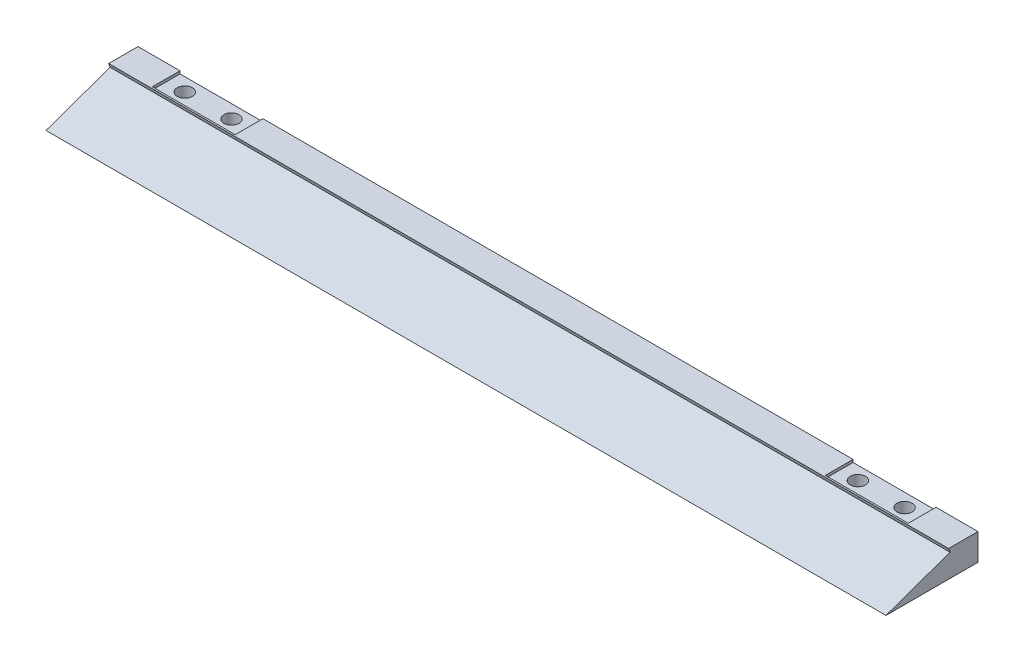
ISO-10303-21;
HEADER;
FILE_DESCRIPTION(('STEP AP214'),'2;1');
FILE_NAME('part.step','',(''),(''),'','','');
FILE_SCHEMA(('AUTOMOTIVE_DESIGN { 1 0 10303 214 1 1 1 1 }'));
ENDSEC;
DATA;
#1=APPLICATION_CONTEXT('core data for automotive mechanical design processes');
#2=APPLICATION_PROTOCOL_DEFINITION('international standard','automotive_design',2000,#1);
#3=PRODUCT_CONTEXT('',#1,'mechanical');
#4=PRODUCT('Part','Part','',(#3));
#5=PRODUCT_RELATED_PRODUCT_CATEGORY('part','',(#4));
#6=PRODUCT_DEFINITION_FORMATION('','',#4);
#7=PRODUCT_DEFINITION_CONTEXT('part definition',#1,'design');
#8=PRODUCT_DEFINITION('design','',#6,#7);
#9=PRODUCT_DEFINITION_SHAPE('','',#8);
#10=(LENGTH_UNIT() NAMED_UNIT(*) SI_UNIT(.MILLI.,.METRE.));
#11=(NAMED_UNIT(*) PLANE_ANGLE_UNIT() SI_UNIT($,.RADIAN.));
#12=(NAMED_UNIT(*) SI_UNIT($,.STERADIAN.) SOLID_ANGLE_UNIT());
#13=UNCERTAINTY_MEASURE_WITH_UNIT(LENGTH_MEASURE(1.E-05),#10,'distance_accuracy_value','');
#14=(GEOMETRIC_REPRESENTATION_CONTEXT(3) GLOBAL_UNCERTAINTY_ASSIGNED_CONTEXT((#13)) GLOBAL_UNIT_ASSIGNED_CONTEXT((#10,
#11,#12)) REPRESENTATION_CONTEXT('',''));
#15=CARTESIAN_POINT('',(0.,0.,0.));
#16=DIRECTION('',(0.,0.,1.));
#17=DIRECTION('',(1.,0.,0.));
#18=AXIS2_PLACEMENT_3D('',#15,#16,#17);
#19=CARTESIAN_POINT('',(0.,0.,0.));
#20=DIRECTION('',(0.,-1.,0.));
#21=DIRECTION('',(0.,0.,-1.));
#22=AXIS2_PLACEMENT_3D('',#19,#20,#21);
#23=PLANE('',#22);
#24=DIRECTION('',(-1.,0.,0.));
#25=VECTOR('',#24,1.);
#26=CARTESIAN_POINT('',(-83.164600061,0.,-14.35));
#27=LINE('',#26,#25);
#28=CARTESIAN_POINT('',(-83.164600061,0.,-14.35));
#29=VERTEX_POINT('',#28);
#30=CARTESIAN_POINT('',(-88.214600061,0.,-14.35));
#31=VERTEX_POINT('',#30);
#32=EDGE_CURVE('E308',#29,#31,#27,.T.);
#33=ORIENTED_EDGE('',*,*,#32,.T.);
#34=DIRECTION('',(0.,0.,1.));
#35=VECTOR('',#34,1.);
#36=CARTESIAN_POINT('',(-88.214600061,0.,-14.35));
#37=LINE('',#36,#35);
#38=CARTESIAN_POINT('',(-88.214600061,0.,-9.30000000000001));
#39=VERTEX_POINT('',#38);
#40=EDGE_CURVE('E69',#31,#39,#37,.T.);
#41=ORIENTED_EDGE('',*,*,#40,.T.);
#42=DIRECTION('',(1.,0.,0.));
#43=VECTOR('',#42,1.);
#44=CARTESIAN_POINT('',(-83.164600061,0.,-9.30000000000001));
#45=LINE('',#44,#43);
#46=CARTESIAN_POINT('',(-83.164600061,0.,-9.30000000000001));
#47=VERTEX_POINT('',#46);
#48=EDGE_CURVE('E296',#39,#47,#45,.T.);
#49=ORIENTED_EDGE('',*,*,#48,.T.);
#50=DIRECTION('',(0.,0.,-1.));
#51=VECTOR('',#50,1.);
#52=CARTESIAN_POINT('',(-83.164600061,0.,-14.35));
#53=LINE('',#52,#51);
#54=EDGE_CURVE('E312',#47,#29,#53,.T.);
#55=ORIENTED_EDGE('',*,*,#54,.T.);
#56=EDGE_LOOP('',(#33,#41,#49,#55));
#57=FACE_BOUND('',#56,.T.);
#58=DIRECTION('',(0.,0.,1.));
#59=VECTOR('',#58,1.);
#60=CARTESIAN_POINT('',(77.089400061,0.,-14.35));
#61=LINE('',#60,#59);
#62=CARTESIAN_POINT('',(77.089400061,0.,-14.35));
#63=VERTEX_POINT('',#62);
#64=CARTESIAN_POINT('',(77.089400061,0.,-9.30000000000001));
#65=VERTEX_POINT('',#64);
#66=EDGE_CURVE('E356',#63,#65,#61,.T.);
#67=ORIENTED_EDGE('',*,*,#66,.F.);
#68=DIRECTION('',(1.,0.,0.));
#69=VECTOR('',#68,1.);
#70=CARTESIAN_POINT('',(72.039400061,0.,-14.35));
#71=LINE('',#70,#69);
#72=CARTESIAN_POINT('',(72.039400061,0.,-14.35));
#73=VERTEX_POINT('',#72);
#74=EDGE_CURVE('E343',#73,#63,#71,.T.);
#75=ORIENTED_EDGE('',*,*,#74,.F.);
#76=DIRECTION('',(0.,0.,-1.));
#77=VECTOR('',#76,1.);
#78=CARTESIAN_POINT('',(72.039400061,0.,-14.35));
#79=LINE('',#78,#77);
#80=CARTESIAN_POINT('',(72.039400061,0.,-9.30000000000001));
#81=VERTEX_POINT('',#80);
#82=EDGE_CURVE('E364',#81,#73,#79,.T.);
#83=ORIENTED_EDGE('',*,*,#82,.F.);
#84=DIRECTION('',(-1.,0.,0.));
#85=VECTOR('',#84,1.);
#86=CARTESIAN_POINT('',(72.039400061,0.,-9.30000000000001));
#87=LINE('',#86,#85);
#88=EDGE_CURVE('E359',#65,#81,#87,.T.);
#89=ORIENTED_EDGE('',*,*,#88,.F.);
#90=EDGE_LOOP('',(#67,#75,#83,#89));
#91=FACE_BOUND('',#90,.T.);
#92=DIRECTION('',(0.,0.,1.));
#93=VECTOR('',#92,1.);
#94=CARTESIAN_POINT('',(88.214600061,0.,-14.35));
#95=LINE('',#94,#93);
#96=CARTESIAN_POINT('',(88.214600061,0.,-14.35));
#97=VERTEX_POINT('',#96);
#98=CARTESIAN_POINT('',(88.214600061,0.,-9.30000000000001));
#99=VERTEX_POINT('',#98);
#100=EDGE_CURVE('E360',#97,#99,#95,.T.);
#101=ORIENTED_EDGE('',*,*,#100,.F.);
#102=DIRECTION('',(1.,0.,0.));
#103=VECTOR('',#102,1.);
#104=CARTESIAN_POINT('',(83.164600061,0.,-14.35));
#105=LINE('',#104,#103);
#106=CARTESIAN_POINT('',(83.164600061,0.,-14.35));
#107=VERTEX_POINT('',#106);
#108=EDGE_CURVE('E397',#107,#97,#105,.T.);
#109=ORIENTED_EDGE('',*,*,#108,.F.);
#110=DIRECTION('',(0.,0.,-1.));
#111=VECTOR('',#110,1.);
#112=CARTESIAN_POINT('',(83.164600061,0.,-14.35));
#113=LINE('',#112,#111);
#114=CARTESIAN_POINT('',(83.164600061,0.,-9.30000000000001));
#115=VERTEX_POINT('',#114);
#116=EDGE_CURVE('E401',#115,#107,#113,.T.);
#117=ORIENTED_EDGE('',*,*,#116,.F.);
#118=DIRECTION('',(-1.,0.,0.));
#119=VECTOR('',#118,1.);
#120=CARTESIAN_POINT('',(83.164600061,0.,-9.30000000000001));
#121=LINE('',#120,#119);
#122=EDGE_CURVE('E406',#99,#115,#121,.T.);
#123=ORIENTED_EDGE('',*,*,#122,.F.);
#124=EDGE_LOOP('',(#101,#109,#117,#123));
#125=FACE_BOUND('',#124,.T.);
#126=DIRECTION('',(1.,0.,0.));
#127=VECTOR('',#126,1.);
#128=CARTESIAN_POINT('',(-100.001,0.,6.90747050814267));
#129=LINE('',#128,#127);
#130=CARTESIAN_POINT('',(-100.,0.,6.90747050814267));
#131=VERTEX_POINT('',#130);
#132=CARTESIAN_POINT('',(100.,0.,6.90747050814267));
#133=VERTEX_POINT('',#132);
#134=EDGE_CURVE('E526',#131,#133,#129,.T.);
#135=ORIENTED_EDGE('',*,*,#134,.F.);
#136=DIRECTION('',(0.,0.,1.));
#137=VECTOR('',#136,1.);
#138=CARTESIAN_POINT('',(-100.,0.,15.));
#139=LINE('',#138,#137);
#140=CARTESIAN_POINT('',(-100.,0.,-15.));
#141=VERTEX_POINT('',#140);
#142=EDGE_CURVE('E544',#141,#131,#139,.T.);
#143=ORIENTED_EDGE('',*,*,#142,.F.);
#144=DIRECTION('',(-1.,0.,0.));
#145=VECTOR('',#144,1.);
#146=CARTESIAN_POINT('',(-100.,0.,-15.));
#147=LINE('',#146,#145);
#148=CARTESIAN_POINT('',(100.,0.,-15.));
#149=VERTEX_POINT('',#148);
#150=EDGE_CURVE('E556',#149,#141,#147,.T.);
#151=ORIENTED_EDGE('',*,*,#150,.F.);
#152=DIRECTION('',(0.,0.,-1.));
#153=VECTOR('',#152,1.);
#154=CARTESIAN_POINT('',(100.,0.,15.));
#155=LINE('',#154,#153);
#156=EDGE_CURVE('E539',#133,#149,#155,.T.);
#157=ORIENTED_EDGE('',*,*,#156,.F.);
#158=EDGE_LOOP('',(#135,#143,#151,#157));
#159=FACE_BOUND('',#158,.T.);
#160=DIRECTION('',(-1.,0.,0.));
#161=VECTOR('',#160,1.);
#162=CARTESIAN_POINT('',(-72.039400061,0.,-14.35));
#163=LINE('',#162,#161);
#164=CARTESIAN_POINT('',(-72.039400061,0.,-14.35));
#165=VERTEX_POINT('',#164);
#166=CARTESIAN_POINT('',(-77.089400061,0.,-14.35));
#167=VERTEX_POINT('',#166);
#168=EDGE_CURVE('E275',#165,#167,#163,.T.);
#169=ORIENTED_EDGE('',*,*,#168,.T.);
#170=DIRECTION('',(0.,0.,1.));
#171=VECTOR('',#170,1.);
#172=CARTESIAN_POINT('',(-77.089400061,0.,-14.35));
#173=LINE('',#172,#171);
#174=CARTESIAN_POINT('',(-77.089400061,0.,-9.30000000000001));
#175=VERTEX_POINT('',#174);
#176=EDGE_CURVE('E61',#167,#175,#173,.T.);
#177=ORIENTED_EDGE('',*,*,#176,.T.);
#178=DIRECTION('',(1.,0.,0.));
#179=VECTOR('',#178,1.);
#180=CARTESIAN_POINT('',(-72.039400061,0.,-9.30000000000001));
#181=LINE('',#180,#179);
#182=CARTESIAN_POINT('',(-72.039400061,0.,-9.30000000000001));
#183=VERTEX_POINT('',#182);
#184=EDGE_CURVE('E262',#175,#183,#181,.T.);
#185=ORIENTED_EDGE('',*,*,#184,.T.);
#186=DIRECTION('',(0.,0.,-1.));
#187=VECTOR('',#186,1.);
#188=CARTESIAN_POINT('',(-72.039400061,0.,-14.35));
#189=LINE('',#188,#187);
#190=EDGE_CURVE('E266',#183,#165,#189,.T.);
#191=ORIENTED_EDGE('',*,*,#190,.T.);
#192=EDGE_LOOP('',(#169,#177,#185,#191));
#193=FACE_BOUND('',#192,.T.);
#194=ADVANCED_FACE('F43',(#57,#91,#125,#159,#193),#23,.T.);
#195=CARTESIAN_POINT('',(100.,6.35,15.));
#196=DIRECTION('',(-1.,0.,0.));
#197=DIRECTION('',(0.,0.,1.));
#198=AXIS2_PLACEMENT_3D('',#195,#196,#197);
#199=PLANE('',#198);
#200=DIRECTION('',(0.,0.942498447796983,0.334210526315791));
#201=VECTOR('',#200,1.);
#202=CARTESIAN_POINT('',(100.,3.23169736936029,-9.11362603670258));
#203=LINE('',#202,#201);
#204=CARTESIAN_POINT('',(100.,5.40750155220302,-8.34208454206384));
#205=VERTEX_POINT('',#204);
#206=CARTESIAN_POINT('',(100.,6.35,-8.00787401574805));
#207=VERTEX_POINT('',#206);
#208=EDGE_CURVE('E522',#205,#207,#203,.T.);
#209=ORIENTED_EDGE('',*,*,#208,.F.);
#210=DIRECTION('',(0.,0.33421052631579,-0.942498447796983));
#211=VECTOR('',#210,1.);
#212=CARTESIAN_POINT('',(100.,2.17580418284275,0.771541494638734));
#213=LINE('',#212,#211);
#214=EDGE_CURVE('E518',#133,#205,#213,.T.);
#215=ORIENTED_EDGE('',*,*,#214,.F.);
#216=ORIENTED_EDGE('',*,*,#156,.T.);
#217=DIRECTION('',(0.,-1.,0.));
#218=VECTOR('',#217,1.);
#219=CARTESIAN_POINT('',(100.,6.35,-15.));
#220=LINE('',#219,#218);
#221=CARTESIAN_POINT('',(100.,6.35,-15.));
#222=VERTEX_POINT('',#221);
#223=EDGE_CURVE('E11',#222,#149,#220,.T.);
#224=ORIENTED_EDGE('',*,*,#223,.F.);
#225=DIRECTION('',(0.,0.,-1.));
#226=VECTOR('',#225,1.);
#227=CARTESIAN_POINT('',(100.,6.35,15.));
#228=LINE('',#227,#226);
#229=EDGE_CURVE('E540',#207,#222,#228,.T.);
#230=ORIENTED_EDGE('',*,*,#229,.F.);
#231=EDGE_LOOP('',(#209,#215,#216,#224,#230));
#232=FACE_BOUND('',#231,.T.);
#233=ADVANCED_FACE('F45',(#232),#199,.F.);
#234=CARTESIAN_POINT('',(-100.,6.35,-15.));
#235=DIRECTION('',(0.,0.,1.));
#236=DIRECTION('',(1.,0.,0.));
#237=AXIS2_PLACEMENT_3D('',#234,#235,#236);
#238=PLANE('',#237);
#239=DIRECTION('',(-1.,0.,0.));
#240=VECTOR('',#239,1.);
#241=CARTESIAN_POINT('',(-90.0000000000001,5.715,-15.));
#242=LINE('',#241,#240);
#243=CARTESIAN_POINT('',(-70.2540001220001,5.715,-15.));
#244=VERTEX_POINT('',#243);
#245=CARTESIAN_POINT('',(-90.0000000000001,5.715,-15.));
#246=VERTEX_POINT('',#245);
#247=EDGE_CURVE('E440',#244,#246,#242,.T.);
#248=ORIENTED_EDGE('',*,*,#247,.F.);
#249=DIRECTION('',(0.,1.,0.));
#250=VECTOR('',#249,1.);
#251=CARTESIAN_POINT('',(-70.2540001220001,5.715,-15.));
#252=LINE('',#251,#250);
#253=CARTESIAN_POINT('',(-70.2540001220001,6.35,-15.));
#254=VERTEX_POINT('',#253);
#255=EDGE_CURVE('E453',#244,#254,#252,.T.);
#256=ORIENTED_EDGE('',*,*,#255,.T.);
#257=DIRECTION('',(-1.,0.,0.));
#258=VECTOR('',#257,1.);
#259=CARTESIAN_POINT('',(-100.,6.35,-15.));
#260=LINE('',#259,#258);
#261=CARTESIAN_POINT('',(70.254000122,6.35,-15.));
#262=VERTEX_POINT('',#261);
#263=EDGE_CURVE('E550',#262,#254,#260,.T.);
#264=ORIENTED_EDGE('',*,*,#263,.F.);
#265=DIRECTION('',(0.,1.,0.));
#266=VECTOR('',#265,1.);
#267=CARTESIAN_POINT('',(70.254000122,5.715,-15.));
#268=LINE('',#267,#266);
#269=CARTESIAN_POINT('',(70.254000122,5.715,-15.));
#270=VERTEX_POINT('',#269);
#271=EDGE_CURVE('E483',#270,#262,#268,.T.);
#272=ORIENTED_EDGE('',*,*,#271,.F.);
#273=DIRECTION('',(-1.,0.,0.));
#274=VECTOR('',#273,1.);
#275=CARTESIAN_POINT('',(70.254000122,5.715,-15.));
#276=LINE('',#275,#274);
#277=CARTESIAN_POINT('',(90.,5.715,-15.));
#278=VERTEX_POINT('',#277);
#279=EDGE_CURVE('E509',#278,#270,#276,.T.);
#280=ORIENTED_EDGE('',*,*,#279,.F.);
#281=DIRECTION('',(0.,1.,0.));
#282=VECTOR('',#281,1.);
#283=CARTESIAN_POINT('',(90.,5.715,-15.));
#284=LINE('',#283,#282);
#285=CARTESIAN_POINT('',(90.,6.35,-15.));
#286=VERTEX_POINT('',#285);
#287=EDGE_CURVE('E478',#278,#286,#284,.T.);
#288=ORIENTED_EDGE('',*,*,#287,.T.);
#289=EDGE_CURVE('E545',#222,#286,#260,.T.);
#290=ORIENTED_EDGE('',*,*,#289,.F.);
#291=ORIENTED_EDGE('',*,*,#223,.T.);
#292=ORIENTED_EDGE('',*,*,#150,.T.);
#293=DIRECTION('',(0.,-1.,0.));
#294=VECTOR('',#293,1.);
#295=CARTESIAN_POINT('',(-100.,6.35,-15.));
#296=LINE('',#295,#294);
#297=CARTESIAN_POINT('',(-100.,6.35,-15.));
#298=VERTEX_POINT('',#297);
#299=EDGE_CURVE('E53',#298,#141,#296,.T.);
#300=ORIENTED_EDGE('',*,*,#299,.F.);
#301=CARTESIAN_POINT('',(-90.0000000000001,6.35,-15.));
#302=VERTEX_POINT('',#301);
#303=EDGE_CURVE('E543',#302,#298,#260,.T.);
#304=ORIENTED_EDGE('',*,*,#303,.F.);
#305=DIRECTION('',(0.,1.,0.));
#306=VECTOR('',#305,1.);
#307=CARTESIAN_POINT('',(-90.0000000000001,5.715,-15.));
#308=LINE('',#307,#306);
#309=EDGE_CURVE('E472',#246,#302,#308,.T.);
#310=ORIENTED_EDGE('',*,*,#309,.F.);
#311=EDGE_LOOP('',(#248,#256,#264,#272,#280,#288,#290,#291,#292,#300,#304,#310));
#312=FACE_BOUND('',#311,.T.);
#313=ADVANCED_FACE('F602',(#312),#238,.F.);
#314=CARTESIAN_POINT('',(-100.,6.35,15.));
#315=DIRECTION('',(1.,0.,0.));
#316=DIRECTION('',(0.,0.,-1.));
#317=AXIS2_PLACEMENT_3D('',#314,#315,#316);
#318=PLANE('',#317);
#319=ORIENTED_EDGE('',*,*,#142,.T.);
#320=DIRECTION('',(0.,-0.33421052631579,0.942498447796983));
#321=VECTOR('',#320,1.);
#322=CARTESIAN_POINT('',(-100.,2.17580418284275,0.771541494638734));
#323=LINE('',#322,#321);
#324=CARTESIAN_POINT('',(-100.,5.40750155220302,-8.34208454206384));
#325=VERTEX_POINT('',#324);
#326=EDGE_CURVE('E468',#325,#131,#323,.T.);
#327=ORIENTED_EDGE('',*,*,#326,.F.);
#328=DIRECTION('',(0.,-0.942498447796983,-0.334210526315791));
#329=VECTOR('',#328,1.);
#330=CARTESIAN_POINT('',(-100.,3.23169736936029,-9.11362603670258));
#331=LINE('',#330,#329);
#332=CARTESIAN_POINT('',(-100.,6.35,-8.00787401574805));
#333=VERTEX_POINT('',#332);
#334=EDGE_CURVE('E529',#333,#325,#331,.T.);
#335=ORIENTED_EDGE('',*,*,#334,.F.);
#336=DIRECTION('',(0.,0.,1.));
#337=VECTOR('',#336,1.);
#338=CARTESIAN_POINT('',(-100.,6.35,15.));
#339=LINE('',#338,#337);
#340=EDGE_CURVE('E549',#298,#333,#339,.T.);
#341=ORIENTED_EDGE('',*,*,#340,.F.);
#342=ORIENTED_EDGE('',*,*,#299,.T.);
#343=EDGE_LOOP('',(#319,#327,#335,#341,#342));
#344=FACE_BOUND('',#343,.T.);
#345=ADVANCED_FACE('F640',(#344),#318,.F.);
#346=CARTESIAN_POINT('',(0.,6.35,0.));
#347=DIRECTION('',(0.,-1.,0.));
#348=DIRECTION('',(0.,0.,-1.));
#349=AXIS2_PLACEMENT_3D('',#346,#347,#348);
#350=PLANE('',#349);
#351=ORIENTED_EDGE('',*,*,#263,.T.);
#352=DIRECTION('',(0.,0.,-1.));
#353=VECTOR('',#352,1.);
#354=CARTESIAN_POINT('',(-70.2540001220001,6.35,-8.39600000000002));
#355=LINE('',#354,#353);
#356=CARTESIAN_POINT('',(-70.2540001220001,6.35,-8.39600000000002));
#357=VERTEX_POINT('',#356);
#358=EDGE_CURVE('E454',#357,#254,#355,.T.);
#359=ORIENTED_EDGE('',*,*,#358,.F.);
#360=DIRECTION('',(1.,0.,0.));
#361=VECTOR('',#360,1.);
#362=CARTESIAN_POINT('',(-90.0000000000001,6.35,-8.39600000000002));
#363=LINE('',#362,#361);
#364=CARTESIAN_POINT('',(-90.0000000000001,6.35,-8.39600000000002));
#365=VERTEX_POINT('',#364);
#366=EDGE_CURVE('E441',#365,#357,#363,.T.);
#367=ORIENTED_EDGE('',*,*,#366,.F.);
#368=DIRECTION('',(0.,0.,1.));
#369=VECTOR('',#368,1.);
#370=CARTESIAN_POINT('',(-90.0000000000001,6.35,-8.39600000000002));
#371=LINE('',#370,#369);
#372=EDGE_CURVE('E457',#302,#365,#371,.T.);
#373=ORIENTED_EDGE('',*,*,#372,.F.);
#374=ORIENTED_EDGE('',*,*,#303,.T.);
#375=ORIENTED_EDGE('',*,*,#340,.T.);
#376=DIRECTION('',(1.,0.,0.));
#377=VECTOR('',#376,1.);
#378=CARTESIAN_POINT('',(-100.001,6.35,-8.00787401574805));
#379=LINE('',#378,#377);
#380=EDGE_CURVE('E530',#333,#207,#379,.T.);
#381=ORIENTED_EDGE('',*,*,#380,.T.);
#382=ORIENTED_EDGE('',*,*,#229,.T.);
#383=ORIENTED_EDGE('',*,*,#289,.T.);
#384=DIRECTION('',(0.,0.,-1.));
#385=VECTOR('',#384,1.);
#386=CARTESIAN_POINT('',(90.,6.35,-15.));
#387=LINE('',#386,#385);
#388=CARTESIAN_POINT('',(90.,6.35,-8.39600000000002));
#389=VERTEX_POINT('',#388);
#390=EDGE_CURVE('E458',#389,#286,#387,.T.);
#391=ORIENTED_EDGE('',*,*,#390,.F.);
#392=DIRECTION('',(1.,0.,0.));
#393=VECTOR('',#392,1.);
#394=CARTESIAN_POINT('',(70.254000122,6.35,-8.39600000000002));
#395=LINE('',#394,#393);
#396=CARTESIAN_POINT('',(70.254000122,6.35,-8.39600000000002));
#397=VERTEX_POINT('',#396);
#398=EDGE_CURVE('E491',#397,#389,#395,.T.);
#399=ORIENTED_EDGE('',*,*,#398,.F.);
#400=DIRECTION('',(0.,0.,1.));
#401=VECTOR('',#400,1.);
#402=CARTESIAN_POINT('',(70.254000122,6.35,-15.));
#403=LINE('',#402,#401);
#404=EDGE_CURVE('E495',#262,#397,#403,.T.);
#405=ORIENTED_EDGE('',*,*,#404,.F.);
#406=EDGE_LOOP('',(#351,#359,#367,#373,#374,#375,#381,#382,#383,#391,#399,#405));
#407=FACE_BOUND('',#406,.T.);
#408=ADVANCED_FACE('F611',(#407),#350,.F.);
#409=CARTESIAN_POINT('',(-100.001,2.17580418284275,0.771541494638734));
#410=DIRECTION('',(0.,-0.942498447796983,-0.33421052631579));
#411=DIRECTION('',(0.,0.33421052631579,-0.942498447796983));
#412=AXIS2_PLACEMENT_3D('',#409,#410,#411);
#413=PLANE('',#412);
#414=ORIENTED_EDGE('',*,*,#326,.T.);
#415=ORIENTED_EDGE('',*,*,#134,.T.);
#416=ORIENTED_EDGE('',*,*,#214,.T.);
#417=DIRECTION('',(1.,0.,0.));
#418=VECTOR('',#417,1.);
#419=CARTESIAN_POINT('',(-100.001,5.40750155220302,-8.34208454206384));
#420=LINE('',#419,#418);
#421=EDGE_CURVE('E525',#325,#205,#420,.T.);
#422=ORIENTED_EDGE('',*,*,#421,.F.);
#423=EDGE_LOOP('',(#414,#415,#416,#422));
#424=FACE_BOUND('',#423,.T.);
#425=ADVANCED_FACE('F660',(#424),#413,.F.);
#426=CARTESIAN_POINT('',(-100.001,3.23169736936029,-9.11362603670258));
#427=DIRECTION('',(0.,0.334210526315791,-0.942498447796983));
#428=DIRECTION('',(0.,0.942498447796983,0.334210526315791));
#429=AXIS2_PLACEMENT_3D('',#426,#427,#428);
#430=PLANE('',#429);
#431=ORIENTED_EDGE('',*,*,#334,.T.);
#432=ORIENTED_EDGE('',*,*,#421,.T.);
#433=ORIENTED_EDGE('',*,*,#208,.T.);
#434=ORIENTED_EDGE('',*,*,#380,.F.);
#435=EDGE_LOOP('',(#431,#432,#433,#434));
#436=FACE_BOUND('',#435,.T.);
#437=ADVANCED_FACE('F666',(#436),#430,.F.);
#438=CARTESIAN_POINT('',(90.,5.715,-15.));
#439=DIRECTION('',(1.,0.,0.));
#440=DIRECTION('',(0.,0.,-1.));
#441=AXIS2_PLACEMENT_3D('',#438,#439,#440);
#442=PLANE('',#441);
#443=ORIENTED_EDGE('',*,*,#390,.T.);
#444=ORIENTED_EDGE('',*,*,#287,.F.);
#445=DIRECTION('',(0.,0.,-1.));
#446=VECTOR('',#445,1.);
#447=CARTESIAN_POINT('',(90.,5.715,-15.));
#448=LINE('',#447,#446);
#449=CARTESIAN_POINT('',(90.,5.715,-8.39600000000002));
#450=VERTEX_POINT('',#449);
#451=EDGE_CURVE('E496',#450,#278,#448,.T.);
#452=ORIENTED_EDGE('',*,*,#451,.F.);
#453=DIRECTION('',(0.,1.,0.));
#454=VECTOR('',#453,1.);
#455=CARTESIAN_POINT('',(90.,5.715,-8.39600000000002));
#456=LINE('',#455,#454);
#457=EDGE_CURVE('E430',#450,#389,#456,.T.);
#458=ORIENTED_EDGE('',*,*,#457,.T.);
#459=EDGE_LOOP('',(#443,#444,#452,#458));
#460=FACE_BOUND('',#459,.T.);
#461=ADVANCED_FACE('F672',(#460),#442,.F.);
#462=CARTESIAN_POINT('',(70.254000122,5.715,-8.39600000000002));
#463=DIRECTION('',(0.,0.,1.));
#464=DIRECTION('',(1.,0.,0.));
#465=AXIS2_PLACEMENT_3D('',#462,#463,#464);
#466=PLANE('',#465);
#467=ORIENTED_EDGE('',*,*,#398,.T.);
#468=ORIENTED_EDGE('',*,*,#457,.F.);
#469=DIRECTION('',(1.,0.,0.));
#470=VECTOR('',#469,1.);
#471=CARTESIAN_POINT('',(70.254000122,5.715,-8.39600000000002));
#472=LINE('',#471,#470);
#473=CARTESIAN_POINT('',(70.254000122,5.715,-8.39600000000002));
#474=VERTEX_POINT('',#473);
#475=EDGE_CURVE('E482',#474,#450,#472,.T.);
#476=ORIENTED_EDGE('',*,*,#475,.F.);
#477=DIRECTION('',(0.,1.,0.));
#478=VECTOR('',#477,1.);
#479=CARTESIAN_POINT('',(70.254000122,5.715,-8.39600000000002));
#480=LINE('',#479,#478);
#481=EDGE_CURVE('E486',#474,#397,#480,.T.);
#482=ORIENTED_EDGE('',*,*,#481,.T.);
#483=EDGE_LOOP('',(#467,#468,#476,#482));
#484=FACE_BOUND('',#483,.T.);
#485=ADVANCED_FACE('F679',(#484),#466,.F.);
#486=CARTESIAN_POINT('',(70.254000122,5.715,-15.));
#487=DIRECTION('',(-1.,0.,0.));
#488=DIRECTION('',(0.,0.,1.));
#489=AXIS2_PLACEMENT_3D('',#486,#487,#488);
#490=PLANE('',#489);
#491=ORIENTED_EDGE('',*,*,#404,.T.);
#492=ORIENTED_EDGE('',*,*,#481,.F.);
#493=DIRECTION('',(0.,0.,1.));
#494=VECTOR('',#493,1.);
#495=CARTESIAN_POINT('',(70.254000122,5.715,-15.));
#496=LINE('',#495,#494);
#497=EDGE_CURVE('E505',#270,#474,#496,.T.);
#498=ORIENTED_EDGE('',*,*,#497,.F.);
#499=ORIENTED_EDGE('',*,*,#271,.T.);
#500=EDGE_LOOP('',(#491,#492,#498,#499));
#501=FACE_BOUND('',#500,.T.);
#502=ADVANCED_FACE('F624',(#501),#490,.F.);
#503=CARTESIAN_POINT('',(0.,5.715,0.));
#504=DIRECTION('',(0.,1.,0.));
#505=DIRECTION('',(0.,0.,1.));
#506=AXIS2_PLACEMENT_3D('',#503,#504,#505);
#507=PLANE('',#506);
#508=CARTESIAN_POINT('',(74.564400061,5.715,-11.825));
#509=DIRECTION('',(0.,1.,0.));
#510=DIRECTION('',(0.,0.,1.));
#511=AXIS2_PLACEMENT_3D('',#508,#509,#510);
#512=CIRCLE('',#511,1.8034);
#513=CARTESIAN_POINT('',(74.564400061,5.715,-10.0216));
#514=VERTEX_POINT('',#513);
#515=EDGE_CURVE('E426',#514,#514,#512,.T.);
#516=ORIENTED_EDGE('',*,*,#515,.F.);
#517=EDGE_LOOP('',(#516));
#518=FACE_BOUND('',#517,.T.);
#519=CARTESIAN_POINT('',(85.689600061,5.715,-11.825));
#520=DIRECTION('',(0.,1.,0.));
#521=DIRECTION('',(0.,0.,1.));
#522=AXIS2_PLACEMENT_3D('',#519,#520,#521);
#523=CIRCLE('',#522,1.8034);
#524=CARTESIAN_POINT('',(85.689600061,5.715,-10.0216));
#525=VERTEX_POINT('',#524);
#526=EDGE_CURVE('E431',#525,#525,#523,.T.);
#527=ORIENTED_EDGE('',*,*,#526,.F.);
#528=EDGE_LOOP('',(#527));
#529=FACE_BOUND('',#528,.T.);
#530=ORIENTED_EDGE('',*,*,#451,.T.);
#531=ORIENTED_EDGE('',*,*,#279,.T.);
#532=ORIENTED_EDGE('',*,*,#497,.T.);
#533=ORIENTED_EDGE('',*,*,#475,.T.);
#534=EDGE_LOOP('',(#530,#531,#532,#533));
#535=FACE_BOUND('',#534,.T.);
#536=ADVANCED_FACE('F617',(#518,#529,#535),#507,.T.);
#537=CARTESIAN_POINT('',(-70.2540001220001,5.715,-8.39600000000002));
#538=DIRECTION('',(1.,0.,0.));
#539=DIRECTION('',(0.,0.,-1.));
#540=AXIS2_PLACEMENT_3D('',#537,#538,#539);
#541=PLANE('',#540);
#542=ORIENTED_EDGE('',*,*,#358,.T.);
#543=ORIENTED_EDGE('',*,*,#255,.F.);
#544=DIRECTION('',(0.,0.,-1.));
#545=VECTOR('',#544,1.);
#546=CARTESIAN_POINT('',(-70.2540001220001,5.715,-8.39600000000002));
#547=LINE('',#546,#545);
#548=CARTESIAN_POINT('',(-70.2540001220001,5.715,-8.39600000000002));
#549=VERTEX_POINT('',#548);
#550=EDGE_CURVE('E436',#549,#244,#547,.T.);
#551=ORIENTED_EDGE('',*,*,#550,.F.);
#552=DIRECTION('',(0.,1.,0.));
#553=VECTOR('',#552,1.);
#554=CARTESIAN_POINT('',(-70.2540001220001,5.715,-8.39600000000002));
#555=LINE('',#554,#553);
#556=EDGE_CURVE('E465',#549,#357,#555,.T.);
#557=ORIENTED_EDGE('',*,*,#556,.T.);
#558=EDGE_LOOP('',(#542,#543,#551,#557));
#559=FACE_BOUND('',#558,.T.);
#560=ADVANCED_FACE('F615',(#559),#541,.F.);
#561=CARTESIAN_POINT('',(-90.0000000000001,5.715,-8.39600000000002));
#562=DIRECTION('',(0.,0.,1.));
#563=DIRECTION('',(1.,0.,0.));
#564=AXIS2_PLACEMENT_3D('',#561,#562,#563);
#565=PLANE('',#564);
#566=ORIENTED_EDGE('',*,*,#366,.T.);
#567=ORIENTED_EDGE('',*,*,#556,.F.);
#568=DIRECTION('',(1.,0.,0.));
#569=VECTOR('',#568,1.);
#570=CARTESIAN_POINT('',(-90.0000000000001,5.715,-8.39600000000002));
#571=LINE('',#570,#569);
#572=CARTESIAN_POINT('',(-90.0000000000001,5.715,-8.39600000000002));
#573=VERTEX_POINT('',#572);
#574=EDGE_CURVE('E449',#573,#549,#571,.T.);
#575=ORIENTED_EDGE('',*,*,#574,.F.);
#576=DIRECTION('',(0.,1.,0.));
#577=VECTOR('',#576,1.);
#578=CARTESIAN_POINT('',(-90.0000000000001,5.715,-8.39600000000002));
#579=LINE('',#578,#577);
#580=EDGE_CURVE('E469',#573,#365,#579,.T.);
#581=ORIENTED_EDGE('',*,*,#580,.T.);
#582=EDGE_LOOP('',(#566,#567,#575,#581));
#583=FACE_BOUND('',#582,.T.);
#584=ADVANCED_FACE('F614',(#583),#565,.F.);
#585=CARTESIAN_POINT('',(-90.0000000000001,5.715,-8.39600000000002));
#586=DIRECTION('',(-1.,0.,0.));
#587=DIRECTION('',(0.,0.,1.));
#588=AXIS2_PLACEMENT_3D('',#585,#586,#587);
#589=PLANE('',#588);
#590=ORIENTED_EDGE('',*,*,#372,.T.);
#591=ORIENTED_EDGE('',*,*,#580,.F.);
#592=DIRECTION('',(0.,0.,1.));
#593=VECTOR('',#592,1.);
#594=CARTESIAN_POINT('',(-90.0000000000001,5.715,-8.39600000000002));
#595=LINE('',#594,#593);
#596=EDGE_CURVE('E445',#246,#573,#595,.T.);
#597=ORIENTED_EDGE('',*,*,#596,.F.);
#598=ORIENTED_EDGE('',*,*,#309,.T.);
#599=EDGE_LOOP('',(#590,#591,#597,#598));
#600=FACE_BOUND('',#599,.T.);
#601=ADVANCED_FACE('F593',(#600),#589,.F.);
#602=CARTESIAN_POINT('',(0.,5.715,0.));
#603=DIRECTION('',(0.,-1.,0.));
#604=DIRECTION('',(0.,0.,-1.));
#605=AXIS2_PLACEMENT_3D('',#602,#603,#604);
#606=PLANE('',#605);
#607=CARTESIAN_POINT('',(-74.564400061,5.715,-11.825));
#608=DIRECTION('',(0.,-1.,0.));
#609=DIRECTION('',(0.,0.,1.));
#610=AXIS2_PLACEMENT_3D('',#607,#608,#609);
#611=CIRCLE('',#610,1.8034);
#612=CARTESIAN_POINT('',(-74.564400061,5.715,-10.0216));
#613=VERTEX_POINT('',#612);
#614=EDGE_CURVE('E329',#613,#613,#611,.T.);
#615=ORIENTED_EDGE('',*,*,#614,.T.);
#616=EDGE_LOOP('',(#615));
#617=FACE_BOUND('',#616,.T.);
#618=CARTESIAN_POINT('',(-85.689600061,5.715,-11.825));
#619=DIRECTION('',(0.,-1.,0.));
#620=DIRECTION('',(0.,0.,1.));
#621=AXIS2_PLACEMENT_3D('',#618,#619,#620);
#622=CIRCLE('',#621,1.8034);
#623=CARTESIAN_POINT('',(-85.689600061,5.715,-10.0216));
#624=VERTEX_POINT('',#623);
#625=EDGE_CURVE('E334',#624,#624,#622,.T.);
#626=ORIENTED_EDGE('',*,*,#625,.T.);
#627=EDGE_LOOP('',(#626));
#628=FACE_BOUND('',#627,.T.);
#629=ORIENTED_EDGE('',*,*,#550,.T.);
#630=ORIENTED_EDGE('',*,*,#247,.T.);
#631=ORIENTED_EDGE('',*,*,#596,.T.);
#632=ORIENTED_EDGE('',*,*,#574,.T.);
#633=EDGE_LOOP('',(#629,#630,#631,#632));
#634=FACE_BOUND('',#633,.T.);
#635=ADVANCED_FACE('F589',(#617,#628,#634),#606,.F.);
#636=CARTESIAN_POINT('',(85.689600061,-0.00100000000000013,-11.825));
#637=DIRECTION('',(0.,1.,0.));
#638=DIRECTION('',(0.,0.,1.));
#639=AXIS2_PLACEMENT_3D('',#636,#637,#638);
#640=CYLINDRICAL_SURFACE('',#639,1.8034);
#641=CARTESIAN_POINT('',(85.689600061,2.,-11.825));
#642=DIRECTION('',(0.,1.,0.));
#643=DIRECTION('',(0.,0.,1.));
#644=AXIS2_PLACEMENT_3D('',#641,#642,#643);
#645=CIRCLE('',#644,1.8034);
#646=CARTESIAN_POINT('',(85.689600061,2.,-10.0216));
#647=VERTEX_POINT('',#646);
#648=EDGE_CURVE('E435',#647,#647,#645,.F.);
#649=ORIENTED_EDGE('',*,*,#648,.T.);
#650=EDGE_LOOP('',(#649));
#651=FACE_BOUND('',#650,.T.);
#652=ORIENTED_EDGE('',*,*,#526,.T.);
#653=EDGE_LOOP('',(#652));
#654=FACE_BOUND('',#653,.T.);
#655=ADVANCED_FACE('F592',(#651,#654),#640,.F.);
#656=CARTESIAN_POINT('',(74.564400061,-0.00100000000000013,-11.825));
#657=DIRECTION('',(0.,1.,0.));
#658=DIRECTION('',(0.,0.,1.));
#659=AXIS2_PLACEMENT_3D('',#656,#657,#658);
#660=CYLINDRICAL_SURFACE('',#659,1.8034);
#661=CARTESIAN_POINT('',(74.564400061,2.,-11.825));
#662=DIRECTION('',(0.,1.,0.));
#663=DIRECTION('',(0.,0.,1.));
#664=AXIS2_PLACEMENT_3D('',#661,#662,#663);
#665=CIRCLE('',#664,1.8034);
#666=CARTESIAN_POINT('',(74.564400061,2.,-10.0216));
#667=VERTEX_POINT('',#666);
#668=EDGE_CURVE('E374',#667,#667,#665,.F.);
#669=ORIENTED_EDGE('',*,*,#668,.T.);
#670=EDGE_LOOP('',(#669));
#671=FACE_BOUND('',#670,.T.);
#672=ORIENTED_EDGE('',*,*,#515,.T.);
#673=EDGE_LOOP('',(#672));
#674=FACE_BOUND('',#673,.T.);
#675=ADVANCED_FACE('F714',(#671,#674),#660,.F.);
#676=CARTESIAN_POINT('',(0.,2.,0.));
#677=DIRECTION('',(0.,1.,0.));
#678=DIRECTION('',(0.,0.,1.));
#679=AXIS2_PLACEMENT_3D('',#676,#677,#678);
#680=PLANE('',#679);
#681=DIRECTION('',(0.,0.,1.));
#682=VECTOR('',#681,1.);
#683=CARTESIAN_POINT('',(77.089400061,2.,-14.35));
#684=LINE('',#683,#682);
#685=CARTESIAN_POINT('',(77.089400061,2.,-14.35));
#686=VERTEX_POINT('',#685);
#687=CARTESIAN_POINT('',(77.089400061,2.,-9.30000000000001));
#688=VERTEX_POINT('',#687);
#689=EDGE_CURVE('E338',#686,#688,#684,.T.);
#690=ORIENTED_EDGE('',*,*,#689,.T.);
#691=DIRECTION('',(-1.,0.,0.));
#692=VECTOR('',#691,1.);
#693=CARTESIAN_POINT('',(72.039400061,2.,-9.30000000000001));
#694=LINE('',#693,#692);
#695=CARTESIAN_POINT('',(72.039400061,2.,-9.30000000000001));
#696=VERTEX_POINT('',#695);
#697=EDGE_CURVE('E342',#688,#696,#694,.T.);
#698=ORIENTED_EDGE('',*,*,#697,.T.);
#699=DIRECTION('',(0.,0.,-1.));
#700=VECTOR('',#699,1.);
#701=CARTESIAN_POINT('',(72.039400061,2.,-14.35));
#702=LINE('',#701,#700);
#703=CARTESIAN_POINT('',(72.039400061,2.,-14.35));
#704=VERTEX_POINT('',#703);
#705=EDGE_CURVE('E347',#696,#704,#702,.T.);
#706=ORIENTED_EDGE('',*,*,#705,.T.);
#707=DIRECTION('',(1.,0.,0.));
#708=VECTOR('',#707,1.);
#709=CARTESIAN_POINT('',(72.039400061,2.,-14.35));
#710=LINE('',#709,#708);
#711=EDGE_CURVE('E351',#704,#686,#710,.T.);
#712=ORIENTED_EDGE('',*,*,#711,.T.);
#713=EDGE_LOOP('',(#690,#698,#706,#712));
#714=FACE_BOUND('',#713,.T.);
#715=ORIENTED_EDGE('',*,*,#668,.F.);
#716=EDGE_LOOP('',(#715));
#717=FACE_BOUND('',#716,.T.);
#718=ADVANCED_FACE('F726',(#714,#717),#680,.F.);
#719=CARTESIAN_POINT('',(77.089400061,2.,-14.35));
#720=DIRECTION('',(1.,0.,0.));
#721=DIRECTION('',(0.,0.,-1.));
#722=AXIS2_PLACEMENT_3D('',#719,#720,#721);
#723=PLANE('',#722);
#724=ORIENTED_EDGE('',*,*,#66,.T.);
#725=DIRECTION('',(0.,-1.,0.));
#726=VECTOR('',#725,1.);
#727=CARTESIAN_POINT('',(77.089400061,2.,-9.30000000000001));
#728=LINE('',#727,#726);
#729=EDGE_CURVE('E355',#688,#65,#728,.T.);
#730=ORIENTED_EDGE('',*,*,#729,.F.);
#731=ORIENTED_EDGE('',*,*,#689,.F.);
#732=DIRECTION('',(0.,-1.,0.));
#733=VECTOR('',#732,1.);
#734=CARTESIAN_POINT('',(77.089400061,2.,-14.35));
#735=LINE('',#734,#733);
#736=EDGE_CURVE('E371',#686,#63,#735,.T.);
#737=ORIENTED_EDGE('',*,*,#736,.T.);
#738=EDGE_LOOP('',(#724,#730,#731,#737));
#739=FACE_BOUND('',#738,.T.);
#740=ADVANCED_FACE('F737',(#739),#723,.F.);
#741=CARTESIAN_POINT('',(72.039400061,2.,-14.35));
#742=DIRECTION('',(0.,0.,-1.));
#743=DIRECTION('',(-1.,0.,0.));
#744=AXIS2_PLACEMENT_3D('',#741,#742,#743);
#745=PLANE('',#744);
#746=ORIENTED_EDGE('',*,*,#74,.T.);
#747=ORIENTED_EDGE('',*,*,#736,.F.);
#748=ORIENTED_EDGE('',*,*,#711,.F.);
#749=DIRECTION('',(0.,-1.,0.));
#750=VECTOR('',#749,1.);
#751=CARTESIAN_POINT('',(72.039400061,2.,-14.35));
#752=LINE('',#751,#750);
#753=EDGE_CURVE('E375',#704,#73,#752,.T.);
#754=ORIENTED_EDGE('',*,*,#753,.T.);
#755=EDGE_LOOP('',(#746,#747,#748,#754));
#756=FACE_BOUND('',#755,.T.);
#757=ADVANCED_FACE('F748',(#756),#745,.F.);
#758=CARTESIAN_POINT('',(72.039400061,2.,-14.35));
#759=DIRECTION('',(-1.,0.,0.));
#760=DIRECTION('',(0.,0.,1.));
#761=AXIS2_PLACEMENT_3D('',#758,#759,#760);
#762=PLANE('',#761);
#763=ORIENTED_EDGE('',*,*,#82,.T.);
#764=ORIENTED_EDGE('',*,*,#753,.F.);
#765=ORIENTED_EDGE('',*,*,#705,.F.);
#766=DIRECTION('',(0.,-1.,0.));
#767=VECTOR('',#766,1.);
#768=CARTESIAN_POINT('',(72.039400061,2.,-9.30000000000001));
#769=LINE('',#768,#767);
#770=EDGE_CURVE('E378',#696,#81,#769,.T.);
#771=ORIENTED_EDGE('',*,*,#770,.T.);
#772=EDGE_LOOP('',(#763,#764,#765,#771));
#773=FACE_BOUND('',#772,.T.);
#774=ADVANCED_FACE('F759',(#773),#762,.F.);
#775=CARTESIAN_POINT('',(72.039400061,2.,-9.30000000000001));
#776=DIRECTION('',(0.,0.,1.));
#777=DIRECTION('',(1.,0.,0.));
#778=AXIS2_PLACEMENT_3D('',#775,#776,#777);
#779=PLANE('',#778);
#780=ORIENTED_EDGE('',*,*,#88,.T.);
#781=ORIENTED_EDGE('',*,*,#770,.F.);
#782=ORIENTED_EDGE('',*,*,#697,.F.);
#783=ORIENTED_EDGE('',*,*,#729,.T.);
#784=EDGE_LOOP('',(#780,#781,#782,#783));
#785=FACE_BOUND('',#784,.T.);
#786=ADVANCED_FACE('F770',(#785),#779,.F.);
#787=CARTESIAN_POINT('',(0.,2.,0.));
#788=DIRECTION('',(0.,1.,0.));
#789=DIRECTION('',(0.,0.,1.));
#790=AXIS2_PLACEMENT_3D('',#787,#788,#789);
#791=PLANE('',#790);
#792=DIRECTION('',(0.,0.,1.));
#793=VECTOR('',#792,1.);
#794=CARTESIAN_POINT('',(88.214600061,2.,-14.35));
#795=LINE('',#794,#793);
#796=CARTESIAN_POINT('',(88.214600061,2.,-14.35));
#797=VERTEX_POINT('',#796);
#798=CARTESIAN_POINT('',(88.214600061,2.,-9.30000000000001));
#799=VERTEX_POINT('',#798);
#800=EDGE_CURVE('E402',#797,#799,#795,.T.);
#801=ORIENTED_EDGE('',*,*,#800,.T.);
#802=DIRECTION('',(-1.,0.,0.));
#803=VECTOR('',#802,1.);
#804=CARTESIAN_POINT('',(83.164600061,2.,-9.30000000000001));
#805=LINE('',#804,#803);
#806=CARTESIAN_POINT('',(83.164600061,2.,-9.30000000000001));
#807=VERTEX_POINT('',#806);
#808=EDGE_CURVE('E419',#799,#807,#805,.T.);
#809=ORIENTED_EDGE('',*,*,#808,.T.);
#810=DIRECTION('',(0.,0.,-1.));
#811=VECTOR('',#810,1.);
#812=CARTESIAN_POINT('',(83.164600061,2.,-14.35));
#813=LINE('',#812,#811);
#814=CARTESIAN_POINT('',(83.164600061,2.,-14.35));
#815=VERTEX_POINT('',#814);
#816=EDGE_CURVE('E415',#807,#815,#813,.T.);
#817=ORIENTED_EDGE('',*,*,#816,.T.);
#818=DIRECTION('',(1.,0.,0.));
#819=VECTOR('',#818,1.);
#820=CARTESIAN_POINT('',(83.164600061,2.,-14.35));
#821=LINE('',#820,#819);
#822=EDGE_CURVE('E388',#815,#797,#821,.T.);
#823=ORIENTED_EDGE('',*,*,#822,.T.);
#824=EDGE_LOOP('',(#801,#809,#817,#823));
#825=FACE_BOUND('',#824,.T.);
#826=ORIENTED_EDGE('',*,*,#648,.F.);
#827=EDGE_LOOP('',(#826));
#828=FACE_BOUND('',#827,.T.);
#829=ADVANCED_FACE('F781',(#825,#828),#791,.F.);
#830=CARTESIAN_POINT('',(88.214600061,2.,-14.35));
#831=DIRECTION('',(1.,0.,0.));
#832=DIRECTION('',(0.,0.,-1.));
#833=AXIS2_PLACEMENT_3D('',#830,#831,#832);
#834=PLANE('',#833);
#835=ORIENTED_EDGE('',*,*,#100,.T.);
#836=DIRECTION('',(0.,-1.,0.));
#837=VECTOR('',#836,1.);
#838=CARTESIAN_POINT('',(88.214600061,2.,-9.30000000000001));
#839=LINE('',#838,#837);
#840=EDGE_CURVE('E384',#799,#99,#839,.T.);
#841=ORIENTED_EDGE('',*,*,#840,.F.);
#842=ORIENTED_EDGE('',*,*,#800,.F.);
#843=DIRECTION('',(0.,-1.,0.));
#844=VECTOR('',#843,1.);
#845=CARTESIAN_POINT('',(88.214600061,2.,-14.35));
#846=LINE('',#845,#844);
#847=EDGE_CURVE('E333',#797,#97,#846,.T.);
#848=ORIENTED_EDGE('',*,*,#847,.T.);
#849=EDGE_LOOP('',(#835,#841,#842,#848));
#850=FACE_BOUND('',#849,.T.);
#851=ADVANCED_FACE('F792',(#850),#834,.F.);
#852=CARTESIAN_POINT('',(83.164600061,2.,-14.35));
#853=DIRECTION('',(0.,0.,-1.));
#854=DIRECTION('',(-1.,0.,0.));
#855=AXIS2_PLACEMENT_3D('',#852,#853,#854);
#856=PLANE('',#855);
#857=ORIENTED_EDGE('',*,*,#108,.T.);
#858=ORIENTED_EDGE('',*,*,#847,.F.);
#859=ORIENTED_EDGE('',*,*,#822,.F.);
#860=DIRECTION('',(0.,-1.,0.));
#861=VECTOR('',#860,1.);
#862=CARTESIAN_POINT('',(83.164600061,2.,-14.35));
#863=LINE('',#862,#861);
#864=EDGE_CURVE('E392',#815,#107,#863,.T.);
#865=ORIENTED_EDGE('',*,*,#864,.T.);
#866=EDGE_LOOP('',(#857,#858,#859,#865));
#867=FACE_BOUND('',#866,.T.);
#868=ADVANCED_FACE('F803',(#867),#856,.F.);
#869=CARTESIAN_POINT('',(83.164600061,2.,-14.35));
#870=DIRECTION('',(-1.,0.,0.));
#871=DIRECTION('',(0.,0.,1.));
#872=AXIS2_PLACEMENT_3D('',#869,#870,#871);
#873=PLANE('',#872);
#874=ORIENTED_EDGE('',*,*,#116,.T.);
#875=ORIENTED_EDGE('',*,*,#864,.F.);
#876=ORIENTED_EDGE('',*,*,#816,.F.);
#877=DIRECTION('',(0.,-1.,0.));
#878=VECTOR('',#877,1.);
#879=CARTESIAN_POINT('',(83.164600061,2.,-9.30000000000001));
#880=LINE('',#879,#878);
#881=EDGE_CURVE('E389',#807,#115,#880,.T.);
#882=ORIENTED_EDGE('',*,*,#881,.T.);
#883=EDGE_LOOP('',(#874,#875,#876,#882));
#884=FACE_BOUND('',#883,.T.);
#885=ADVANCED_FACE('F814',(#884),#873,.F.);
#886=CARTESIAN_POINT('',(83.164600061,2.,-9.30000000000001));
#887=DIRECTION('',(0.,0.,1.));
#888=DIRECTION('',(1.,0.,0.));
#889=AXIS2_PLACEMENT_3D('',#886,#887,#888);
#890=PLANE('',#889);
#891=ORIENTED_EDGE('',*,*,#122,.T.);
#892=ORIENTED_EDGE('',*,*,#881,.F.);
#893=ORIENTED_EDGE('',*,*,#808,.F.);
#894=ORIENTED_EDGE('',*,*,#840,.T.);
#895=EDGE_LOOP('',(#891,#892,#893,#894));
#896=FACE_BOUND('',#895,.T.);
#897=ADVANCED_FACE('F585',(#896),#890,.F.);
#898=CARTESIAN_POINT('',(-85.689600061,-0.00100000000000013,-11.825));
#899=DIRECTION('',(0.,1.,0.));
#900=DIRECTION('',(0.,0.,1.));
#901=AXIS2_PLACEMENT_3D('',#898,#899,#900);
#902=CYLINDRICAL_SURFACE('',#901,1.8034);
#903=CARTESIAN_POINT('',(-85.689600061,2.,-11.825));
#904=DIRECTION('',(0.,1.,0.));
#905=DIRECTION('',(0.,0.,1.));
#906=AXIS2_PLACEMENT_3D('',#903,#904,#905);
#907=CIRCLE('',#906,1.8034);
#908=CARTESIAN_POINT('',(-85.689600061,2.,-10.0216));
#909=VERTEX_POINT('',#908);
#910=EDGE_CURVE('E47',#909,#909,#907,.T.);
#911=ORIENTED_EDGE('',*,*,#910,.F.);
#912=EDGE_LOOP('',(#911));
#913=FACE_BOUND('',#912,.T.);
#914=ORIENTED_EDGE('',*,*,#625,.F.);
#915=EDGE_LOOP('',(#914));
#916=FACE_BOUND('',#915,.T.);
#917=ADVANCED_FACE('F581',(#913,#916),#902,.F.);
#918=CARTESIAN_POINT('',(-74.564400061,-0.00100000000000013,-11.825));
#919=DIRECTION('',(0.,1.,0.));
#920=DIRECTION('',(0.,0.,1.));
#921=AXIS2_PLACEMENT_3D('',#918,#919,#920);
#922=CYLINDRICAL_SURFACE('',#921,1.8034);
#923=CARTESIAN_POINT('',(-74.564400061,2.,-11.825));
#924=DIRECTION('',(0.,1.,0.));
#925=DIRECTION('',(0.,0.,1.));
#926=AXIS2_PLACEMENT_3D('',#923,#924,#925);
#927=CIRCLE('',#926,1.8034);
#928=CARTESIAN_POINT('',(-74.564400061,2.,-10.0216));
#929=VERTEX_POINT('',#928);
#930=EDGE_CURVE('E285',#929,#929,#927,.T.);
#931=ORIENTED_EDGE('',*,*,#930,.F.);
#932=EDGE_LOOP('',(#931));
#933=FACE_BOUND('',#932,.T.);
#934=ORIENTED_EDGE('',*,*,#614,.F.);
#935=EDGE_LOOP('',(#934));
#936=FACE_BOUND('',#935,.T.);
#937=ADVANCED_FACE('F584',(#933,#936),#922,.F.);
#938=CARTESIAN_POINT('',(-77.089400061,2.,-14.35));
#939=DIRECTION('',(1.,0.,0.));
#940=DIRECTION('',(0.,0.,-1.));
#941=AXIS2_PLACEMENT_3D('',#938,#939,#940);
#942=PLANE('',#941);
#943=ORIENTED_EDGE('',*,*,#176,.F.);
#944=DIRECTION('',(0.,-1.,0.));
#945=VECTOR('',#944,1.);
#946=CARTESIAN_POINT('',(-77.089400061,2.,-14.35));
#947=LINE('',#946,#945);
#948=CARTESIAN_POINT('',(-77.089400061,2.,-14.35));
#949=VERTEX_POINT('',#948);
#950=EDGE_CURVE('E244',#949,#167,#947,.T.);
#951=ORIENTED_EDGE('',*,*,#950,.F.);
#952=DIRECTION('',(0.,0.,1.));
#953=VECTOR('',#952,1.);
#954=CARTESIAN_POINT('',(-77.089400061,2.,-14.35));
#955=LINE('',#954,#953);
#956=CARTESIAN_POINT('',(-77.089400061,2.,-9.30000000000001));
#957=VERTEX_POINT('',#956);
#958=EDGE_CURVE('E252',#949,#957,#955,.T.);
#959=ORIENTED_EDGE('',*,*,#958,.T.);
#960=DIRECTION('',(0.,-1.,0.));
#961=VECTOR('',#960,1.);
#962=CARTESIAN_POINT('',(-77.089400061,2.,-9.30000000000001));
#963=LINE('',#962,#961);
#964=EDGE_CURVE('E282',#957,#175,#963,.T.);
#965=ORIENTED_EDGE('',*,*,#964,.T.);
#966=EDGE_LOOP('',(#943,#951,#959,#965));
#967=FACE_BOUND('',#966,.T.);
#968=ADVANCED_FACE('F255',(#967),#942,.T.);
#969=CARTESIAN_POINT('',(-72.039400061,2.,-9.30000000000001));
#970=DIRECTION('',(0.,0.,-1.));
#971=DIRECTION('',(-1.,0.,0.));
#972=AXIS2_PLACEMENT_3D('',#969,#970,#971);
#973=PLANE('',#972);
#974=ORIENTED_EDGE('',*,*,#184,.F.);
#975=ORIENTED_EDGE('',*,*,#964,.F.);
#976=DIRECTION('',(1.,0.,0.));
#977=VECTOR('',#976,1.);
#978=CARTESIAN_POINT('',(-72.039400061,2.,-9.30000000000001));
#979=LINE('',#978,#977);
#980=CARTESIAN_POINT('',(-72.039400061,2.,-9.30000000000001));
#981=VERTEX_POINT('',#980);
#982=EDGE_CURVE('E258',#957,#981,#979,.T.);
#983=ORIENTED_EDGE('',*,*,#982,.T.);
#984=DIRECTION('',(0.,-1.,0.));
#985=VECTOR('',#984,1.);
#986=CARTESIAN_POINT('',(-72.039400061,2.,-9.30000000000001));
#987=LINE('',#986,#985);
#988=EDGE_CURVE('E286',#981,#183,#987,.T.);
#989=ORIENTED_EDGE('',*,*,#988,.T.);
#990=EDGE_LOOP('',(#974,#975,#983,#989));
#991=FACE_BOUND('',#990,.T.);
#992=ADVANCED_FACE('F873',(#991),#973,.T.);
#993=CARTESIAN_POINT('',(-72.039400061,2.,-14.35));
#994=DIRECTION('',(-1.,0.,0.));
#995=DIRECTION('',(0.,0.,1.));
#996=AXIS2_PLACEMENT_3D('',#993,#994,#995);
#997=PLANE('',#996);
#998=ORIENTED_EDGE('',*,*,#190,.F.);
#999=ORIENTED_EDGE('',*,*,#988,.F.);
#1000=DIRECTION('',(0.,0.,-1.));
#1001=VECTOR('',#1000,1.);
#1002=CARTESIAN_POINT('',(-72.039400061,2.,-14.35));
#1003=LINE('',#1002,#1001);
#1004=CARTESIAN_POINT('',(-72.039400061,2.,-14.35));
#1005=VERTEX_POINT('',#1004);
#1006=EDGE_CURVE('E251',#981,#1005,#1003,.T.);
#1007=ORIENTED_EDGE('',*,*,#1006,.T.);
#1008=DIRECTION('',(0.,-1.,0.));
#1009=VECTOR('',#1008,1.);
#1010=CARTESIAN_POINT('',(-72.039400061,2.,-14.35));
#1011=LINE('',#1010,#1009);
#1012=EDGE_CURVE('E246',#1005,#165,#1011,.T.);
#1013=ORIENTED_EDGE('',*,*,#1012,.T.);
#1014=EDGE_LOOP('',(#998,#999,#1007,#1013));
#1015=FACE_BOUND('',#1014,.T.);
#1016=ADVANCED_FACE('F883',(#1015),#997,.T.);
#1017=CARTESIAN_POINT('',(-72.039400061,2.,-14.35));
#1018=DIRECTION('',(0.,0.,1.));
#1019=DIRECTION('',(1.,0.,0.));
#1020=AXIS2_PLACEMENT_3D('',#1017,#1018,#1019);
#1021=PLANE('',#1020);
#1022=ORIENTED_EDGE('',*,*,#168,.F.);
#1023=ORIENTED_EDGE('',*,*,#1012,.F.);
#1024=DIRECTION('',(-1.,0.,0.));
#1025=VECTOR('',#1024,1.);
#1026=CARTESIAN_POINT('',(-72.039400061,2.,-14.35));
#1027=LINE('',#1026,#1025);
#1028=EDGE_CURVE('E241',#1005,#949,#1027,.T.);
#1029=ORIENTED_EDGE('',*,*,#1028,.T.);
#1030=ORIENTED_EDGE('',*,*,#950,.T.);
#1031=EDGE_LOOP('',(#1022,#1023,#1029,#1030));
#1032=FACE_BOUND('',#1031,.T.);
#1033=ADVANCED_FACE('F243',(#1032),#1021,.T.);
#1034=CARTESIAN_POINT('',(0.,2.,0.));
#1035=DIRECTION('',(0.,1.,0.));
#1036=DIRECTION('',(0.,0.,1.));
#1037=AXIS2_PLACEMENT_3D('',#1034,#1035,#1036);
#1038=PLANE('',#1037);
#1039=ORIENTED_EDGE('',*,*,#930,.T.);
#1040=EDGE_LOOP('',(#1039));
#1041=FACE_BOUND('',#1040,.T.);
#1042=ORIENTED_EDGE('',*,*,#958,.F.);
#1043=ORIENTED_EDGE('',*,*,#1028,.F.);
#1044=ORIENTED_EDGE('',*,*,#1006,.F.);
#1045=ORIENTED_EDGE('',*,*,#982,.F.);
#1046=EDGE_LOOP('',(#1042,#1043,#1044,#1045));
#1047=FACE_BOUND('',#1046,.T.);
#1048=ADVANCED_FACE('F260',(#1041,#1047),#1038,.F.);
#1049=CARTESIAN_POINT('',(-88.214600061,2.,-14.35));
#1050=DIRECTION('',(1.,0.,0.));
#1051=DIRECTION('',(0.,0.,-1.));
#1052=AXIS2_PLACEMENT_3D('',#1049,#1050,#1051);
#1053=PLANE('',#1052);
#1054=ORIENTED_EDGE('',*,*,#40,.F.);
#1055=DIRECTION('',(0.,-1.,0.));
#1056=VECTOR('',#1055,1.);
#1057=CARTESIAN_POINT('',(-88.214600061,2.,-14.35));
#1058=LINE('',#1057,#1056);
#1059=CARTESIAN_POINT('',(-88.214600061,2.,-14.35));
#1060=VERTEX_POINT('',#1059);
#1061=EDGE_CURVE('E305',#1060,#31,#1058,.T.);
#1062=ORIENTED_EDGE('',*,*,#1061,.F.);
#1063=DIRECTION('',(0.,0.,1.));
#1064=VECTOR('',#1063,1.);
#1065=CARTESIAN_POINT('',(-88.214600061,2.,-14.35));
#1066=LINE('',#1065,#1064);
#1067=CARTESIAN_POINT('',(-88.214600061,2.,-9.30000000000001));
#1068=VERTEX_POINT('',#1067);
#1069=EDGE_CURVE('E291',#1060,#1068,#1066,.T.);
#1070=ORIENTED_EDGE('',*,*,#1069,.T.);
#1071=DIRECTION('',(0.,-1.,0.));
#1072=VECTOR('',#1071,1.);
#1073=CARTESIAN_POINT('',(-88.214600061,2.,-9.30000000000001));
#1074=LINE('',#1073,#1072);
#1075=EDGE_CURVE('E276',#1068,#39,#1074,.T.);
#1076=ORIENTED_EDGE('',*,*,#1075,.T.);
#1077=EDGE_LOOP('',(#1054,#1062,#1070,#1076));
#1078=FACE_BOUND('',#1077,.T.);
#1079=ADVANCED_FACE('F913',(#1078),#1053,.T.);
#1080=CARTESIAN_POINT('',(-83.164600061,2.,-9.30000000000001));
#1081=DIRECTION('',(0.,0.,-1.));
#1082=DIRECTION('',(-1.,0.,0.));
#1083=AXIS2_PLACEMENT_3D('',#1080,#1081,#1082);
#1084=PLANE('',#1083);
#1085=ORIENTED_EDGE('',*,*,#48,.F.);
#1086=ORIENTED_EDGE('',*,*,#1075,.F.);
#1087=DIRECTION('',(1.,0.,0.));
#1088=VECTOR('',#1087,1.);
#1089=CARTESIAN_POINT('',(-83.164600061,2.,-9.30000000000001));
#1090=LINE('',#1089,#1088);
#1091=CARTESIAN_POINT('',(-83.164600061,2.,-9.30000000000001));
#1092=VERTEX_POINT('',#1091);
#1093=EDGE_CURVE('E302',#1068,#1092,#1090,.T.);
#1094=ORIENTED_EDGE('',*,*,#1093,.T.);
#1095=DIRECTION('',(0.,-1.,0.));
#1096=VECTOR('',#1095,1.);
#1097=CARTESIAN_POINT('',(-83.164600061,2.,-9.30000000000001));
#1098=LINE('',#1097,#1096);
#1099=EDGE_CURVE('E321',#1092,#47,#1098,.T.);
#1100=ORIENTED_EDGE('',*,*,#1099,.T.);
#1101=EDGE_LOOP('',(#1085,#1086,#1094,#1100));
#1102=FACE_BOUND('',#1101,.T.);
#1103=ADVANCED_FACE('F923',(#1102),#1084,.T.);
#1104=CARTESIAN_POINT('',(-83.164600061,2.,-14.35));
#1105=DIRECTION('',(-1.,0.,0.));
#1106=DIRECTION('',(0.,0.,1.));
#1107=AXIS2_PLACEMENT_3D('',#1104,#1105,#1106);
#1108=PLANE('',#1107);
#1109=ORIENTED_EDGE('',*,*,#54,.F.);
#1110=ORIENTED_EDGE('',*,*,#1099,.F.);
#1111=DIRECTION('',(0.,0.,-1.));
#1112=VECTOR('',#1111,1.);
#1113=CARTESIAN_POINT('',(-83.164600061,2.,-14.35));
#1114=LINE('',#1113,#1112);
#1115=CARTESIAN_POINT('',(-83.164600061,2.,-14.35));
#1116=VERTEX_POINT('',#1115);
#1117=EDGE_CURVE('E299',#1092,#1116,#1114,.T.);
#1118=ORIENTED_EDGE('',*,*,#1117,.T.);
#1119=DIRECTION('',(0.,-1.,0.));
#1120=VECTOR('',#1119,1.);
#1121=CARTESIAN_POINT('',(-83.164600061,2.,-14.35));
#1122=LINE('',#1121,#1120);
#1123=EDGE_CURVE('E324',#1116,#29,#1122,.T.);
#1124=ORIENTED_EDGE('',*,*,#1123,.T.);
#1125=EDGE_LOOP('',(#1109,#1110,#1118,#1124));
#1126=FACE_BOUND('',#1125,.T.);
#1127=ADVANCED_FACE('F933',(#1126),#1108,.T.);
#1128=CARTESIAN_POINT('',(-83.164600061,2.,-14.35));
#1129=DIRECTION('',(0.,0.,1.));
#1130=DIRECTION('',(1.,0.,0.));
#1131=AXIS2_PLACEMENT_3D('',#1128,#1129,#1130);
#1132=PLANE('',#1131);
#1133=ORIENTED_EDGE('',*,*,#32,.F.);
#1134=ORIENTED_EDGE('',*,*,#1123,.F.);
#1135=DIRECTION('',(-1.,0.,0.));
#1136=VECTOR('',#1135,1.);
#1137=CARTESIAN_POINT('',(-83.164600061,2.,-14.35));
#1138=LINE('',#1137,#1136);
#1139=EDGE_CURVE('E295',#1116,#1060,#1138,.T.);
#1140=ORIENTED_EDGE('',*,*,#1139,.T.);
#1141=ORIENTED_EDGE('',*,*,#1061,.T.);
#1142=EDGE_LOOP('',(#1133,#1134,#1140,#1141));
#1143=FACE_BOUND('',#1142,.T.);
#1144=ADVANCED_FACE('F944',(#1143),#1132,.T.);
#1145=CARTESIAN_POINT('',(0.,2.,0.));
#1146=DIRECTION('',(0.,1.,0.));
#1147=DIRECTION('',(0.,0.,1.));
#1148=AXIS2_PLACEMENT_3D('',#1145,#1146,#1147);
#1149=PLANE('',#1148);
#1150=ORIENTED_EDGE('',*,*,#910,.T.);
#1151=EDGE_LOOP('',(#1150));
#1152=FACE_BOUND('',#1151,.T.);
#1153=ORIENTED_EDGE('',*,*,#1069,.F.);
#1154=ORIENTED_EDGE('',*,*,#1139,.F.);
#1155=ORIENTED_EDGE('',*,*,#1117,.F.);
#1156=ORIENTED_EDGE('',*,*,#1093,.F.);
#1157=EDGE_LOOP('',(#1153,#1154,#1155,#1156));
#1158=FACE_BOUND('',#1157,.T.);
#1159=ADVANCED_FACE('F578',(#1152,#1158),#1149,.F.);
#1160=CLOSED_SHELL('',(#194,#233,#313,#345,#408,#425,#437,#461,#485,#502,#536,#560,#584,#601,
#635,#655,#675,#718,#740,#757,#774,#786,#829,#851,#868,#885,#897,#917,#937,#968,#992,#1016,
#1033,#1048,#1079,#1103,#1127,#1144,#1159));
#1161=MANIFOLD_SOLID_BREP('B2',#1160);
#1162=ADVANCED_BREP_SHAPE_REPRESENTATION('',(#18,#1161),#14);
#1163=SHAPE_DEFINITION_REPRESENTATION(#9,#1162);
ENDSEC;
END-ISO-10303-21;
